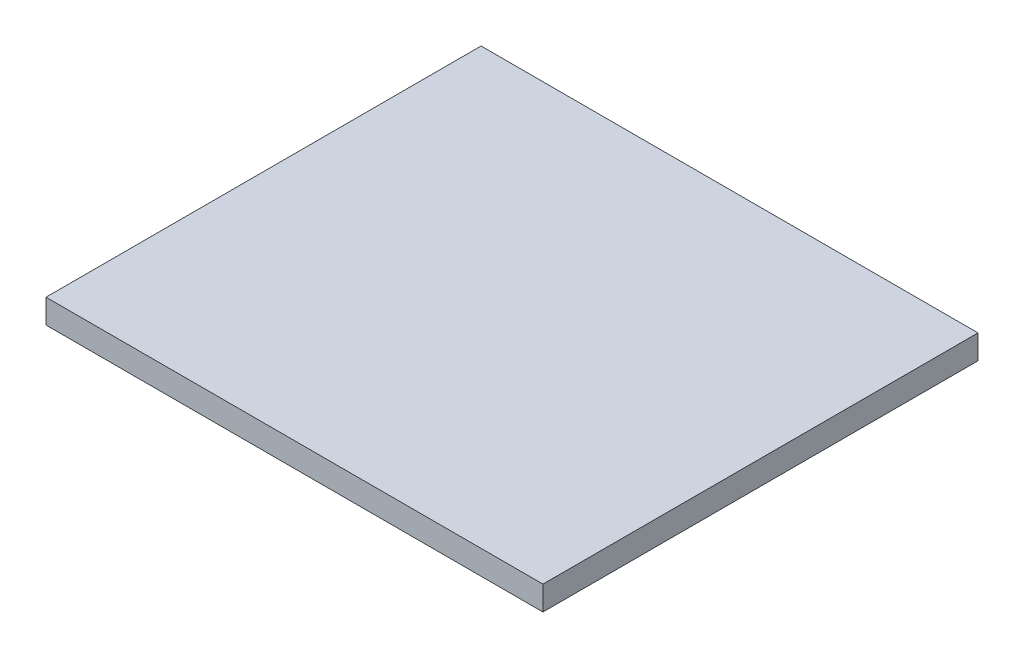
ISO-10303-21;
HEADER;
FILE_DESCRIPTION(('STEP AP214'),'2;1');
FILE_NAME('part.step','',(''),(''),'','','');
FILE_SCHEMA(('AUTOMOTIVE_DESIGN { 1 0 10303 214 1 1 1 1 }'));
ENDSEC;
DATA;
#1=APPLICATION_CONTEXT('core data for automotive mechanical design processes');
#2=APPLICATION_PROTOCOL_DEFINITION('international standard','automotive_design',2000,#1);
#3=PRODUCT_CONTEXT('',#1,'mechanical');
#4=PRODUCT('Part','Part','',(#3));
#5=PRODUCT_RELATED_PRODUCT_CATEGORY('part','',(#4));
#6=PRODUCT_DEFINITION_FORMATION('','',#4);
#7=PRODUCT_DEFINITION_CONTEXT('part definition',#1,'design');
#8=PRODUCT_DEFINITION('design','',#6,#7);
#9=PRODUCT_DEFINITION_SHAPE('','',#8);
#10=(LENGTH_UNIT() NAMED_UNIT(*) SI_UNIT(.MILLI.,.METRE.));
#11=(NAMED_UNIT(*) PLANE_ANGLE_UNIT() SI_UNIT($,.RADIAN.));
#12=(NAMED_UNIT(*) SI_UNIT($,.STERADIAN.) SOLID_ANGLE_UNIT());
#13=UNCERTAINTY_MEASURE_WITH_UNIT(LENGTH_MEASURE(1.E-05),#10,'distance_accuracy_value','');
#14=(GEOMETRIC_REPRESENTATION_CONTEXT(3) GLOBAL_UNCERTAINTY_ASSIGNED_CONTEXT((#13)) GLOBAL_UNIT_ASSIGNED_CONTEXT((#10,
#11,#12)) REPRESENTATION_CONTEXT('',''));
#15=CARTESIAN_POINT('',(0.,0.,0.));
#16=DIRECTION('',(0.,0.,1.));
#17=DIRECTION('',(1.,0.,0.));
#18=AXIS2_PLACEMENT_3D('',#15,#16,#17);
#19=CARTESIAN_POINT('',(13.1322838103947,1.,-58.7968161510852));
#20=DIRECTION('',(-1.,0.,0.));
#21=DIRECTION('',(0.,1.,0.));
#22=AXIS2_PLACEMENT_3D('',#19,#20,#21);
#23=PLANE('',#22);
#24=DIRECTION('',(0.,0.,-1.));
#25=VECTOR('',#24,1.);
#26=CARTESIAN_POINT('',(13.1322838103947,0.,-58.7968161510852));
#27=LINE('',#26,#25);
#28=CARTESIAN_POINT('',(13.1322838103947,0.,-40.7968161510852));
#29=VERTEX_POINT('',#28);
#30=CARTESIAN_POINT('',(13.1322838103947,0.,-58.7968161510852));
#31=VERTEX_POINT('',#30);
#32=EDGE_CURVE('E118',#29,#31,#27,.T.);
#33=ORIENTED_EDGE('',*,*,#32,.T.);
#34=DIRECTION('',(0.,-1.,0.));
#35=VECTOR('',#34,1.);
#36=CARTESIAN_POINT('',(13.1322838103947,1.,-58.7968161510852));
#37=LINE('',#36,#35);
#38=CARTESIAN_POINT('',(13.1322838103947,1.,-58.7968161510852));
#39=VERTEX_POINT('',#38);
#40=EDGE_CURVE('E9',#39,#31,#37,.T.);
#41=ORIENTED_EDGE('',*,*,#40,.F.);
#42=DIRECTION('',(0.,0.,-1.));
#43=VECTOR('',#42,1.);
#44=CARTESIAN_POINT('',(13.1322838103947,1.,-58.7968161510852));
#45=LINE('',#44,#43);
#46=CARTESIAN_POINT('',(13.1322838103947,1.,-40.7968161510852));
#47=VERTEX_POINT('',#46);
#48=EDGE_CURVE('E87',#47,#39,#45,.T.);
#49=ORIENTED_EDGE('',*,*,#48,.F.);
#50=DIRECTION('',(0.,-1.,0.));
#51=VECTOR('',#50,1.);
#52=CARTESIAN_POINT('',(13.1322838103947,1.,-40.7968161510852));
#53=LINE('',#52,#51);
#54=EDGE_CURVE('E69',#47,#29,#53,.T.);
#55=ORIENTED_EDGE('',*,*,#54,.T.);
#56=EDGE_LOOP('',(#33,#41,#49,#55));
#57=FACE_BOUND('',#56,.T.);
#58=ADVANCED_FACE('F15',(#57),#23,.F.);
#59=CARTESIAN_POINT('',(-7.42771618960535,1.,-58.7968161510852));
#60=DIRECTION('',(0.,0.,1.));
#61=DIRECTION('',(1.,0.,0.));
#62=AXIS2_PLACEMENT_3D('',#59,#60,#61);
#63=PLANE('',#62);
#64=DIRECTION('',(-1.,0.,0.));
#65=VECTOR('',#64,1.);
#66=CARTESIAN_POINT('',(-7.42771618960535,0.,-58.7968161510852));
#67=LINE('',#66,#65);
#68=CARTESIAN_POINT('',(-7.42771618960535,0.,-58.7968161510852));
#69=VERTEX_POINT('',#68);
#70=EDGE_CURVE('E93',#31,#69,#67,.T.);
#71=ORIENTED_EDGE('',*,*,#70,.T.);
#72=DIRECTION('',(0.,-1.,0.));
#73=VECTOR('',#72,1.);
#74=CARTESIAN_POINT('',(-7.42771618960535,1.,-58.7968161510852));
#75=LINE('',#74,#73);
#76=CARTESIAN_POINT('',(-7.42771618960535,1.,-58.7968161510852));
#77=VERTEX_POINT('',#76);
#78=EDGE_CURVE('E24',#77,#69,#75,.T.);
#79=ORIENTED_EDGE('',*,*,#78,.F.);
#80=DIRECTION('',(-1.,0.,0.));
#81=VECTOR('',#80,1.);
#82=CARTESIAN_POINT('',(-7.42771618960535,1.,-58.7968161510852));
#83=LINE('',#82,#81);
#84=EDGE_CURVE('E92',#39,#77,#83,.T.);
#85=ORIENTED_EDGE('',*,*,#84,.F.);
#86=ORIENTED_EDGE('',*,*,#40,.T.);
#87=EDGE_LOOP('',(#71,#79,#85,#86));
#88=FACE_BOUND('',#87,.T.);
#89=ADVANCED_FACE('F17',(#88),#63,.F.);
#90=CARTESIAN_POINT('',(-7.42771618960535,1.,-58.7968161510852));
#91=DIRECTION('',(1.,0.,0.));
#92=DIRECTION('',(0.,0.,-1.));
#93=AXIS2_PLACEMENT_3D('',#90,#91,#92);
#94=PLANE('',#93);
#95=DIRECTION('',(0.,0.,1.));
#96=VECTOR('',#95,1.);
#97=CARTESIAN_POINT('',(-7.42771618960535,0.,-58.7968161510852));
#98=LINE('',#97,#96);
#99=CARTESIAN_POINT('',(-7.42771618960534,0.,-40.7968161510852));
#100=VERTEX_POINT('',#99);
#101=EDGE_CURVE('E101',#69,#100,#98,.T.);
#102=ORIENTED_EDGE('',*,*,#101,.T.);
#103=DIRECTION('',(0.,-1.,0.));
#104=VECTOR('',#103,1.);
#105=CARTESIAN_POINT('',(-7.42771618960534,1.,-40.7968161510852));
#106=LINE('',#105,#104);
#107=CARTESIAN_POINT('',(-7.42771618960534,1.,-40.7968161510852));
#108=VERTEX_POINT('',#107);
#109=EDGE_CURVE('E37',#108,#100,#106,.T.);
#110=ORIENTED_EDGE('',*,*,#109,.F.);
#111=DIRECTION('',(0.,0.,1.));
#112=VECTOR('',#111,1.);
#113=CARTESIAN_POINT('',(-7.42771618960535,1.,-58.7968161510852));
#114=LINE('',#113,#112);
#115=EDGE_CURVE('E88',#77,#108,#114,.T.);
#116=ORIENTED_EDGE('',*,*,#115,.F.);
#117=ORIENTED_EDGE('',*,*,#78,.T.);
#118=EDGE_LOOP('',(#102,#110,#116,#117));
#119=FACE_BOUND('',#118,.T.);
#120=ADVANCED_FACE('F113',(#119),#94,.F.);
#121=CARTESIAN_POINT('',(-7.42771618960534,1.,-40.7968161510852));
#122=DIRECTION('',(0.,0.,-1.));
#123=DIRECTION('',(0.,-1.,0.));
#124=AXIS2_PLACEMENT_3D('',#121,#122,#123);
#125=PLANE('',#124);
#126=DIRECTION('',(1.,0.,0.));
#127=VECTOR('',#126,1.);
#128=CARTESIAN_POINT('',(-7.42771618960534,0.,-40.7968161510852));
#129=LINE('',#128,#127);
#130=EDGE_CURVE('E76',#100,#29,#129,.T.);
#131=ORIENTED_EDGE('',*,*,#130,.T.);
#132=ORIENTED_EDGE('',*,*,#54,.F.);
#133=DIRECTION('',(1.,0.,0.));
#134=VECTOR('',#133,1.);
#135=CARTESIAN_POINT('',(-7.42771618960534,1.,-40.7968161510852));
#136=LINE('',#135,#134);
#137=EDGE_CURVE('E72',#108,#47,#136,.T.);
#138=ORIENTED_EDGE('',*,*,#137,.F.);
#139=ORIENTED_EDGE('',*,*,#109,.T.);
#140=EDGE_LOOP('',(#131,#132,#138,#139));
#141=FACE_BOUND('',#140,.T.);
#142=ADVANCED_FACE('F71',(#141),#125,.F.);
#143=CARTESIAN_POINT('',(0.,1.,0.));
#144=DIRECTION('',(0.,1.,0.));
#145=DIRECTION('',(1.,0.,0.));
#146=AXIS2_PLACEMENT_3D('',#143,#144,#145);
#147=PLANE('',#146);
#148=ORIENTED_EDGE('',*,*,#48,.T.);
#149=ORIENTED_EDGE('',*,*,#84,.T.);
#150=ORIENTED_EDGE('',*,*,#115,.T.);
#151=ORIENTED_EDGE('',*,*,#137,.T.);
#152=EDGE_LOOP('',(#148,#149,#150,#151));
#153=FACE_BOUND('',#152,.T.);
#154=ADVANCED_FACE('F85',(#153),#147,.T.);
#155=CARTESIAN_POINT('',(0.,0.,0.));
#156=DIRECTION('',(0.,1.,0.));
#157=DIRECTION('',(1.,0.,0.));
#158=AXIS2_PLACEMENT_3D('',#155,#156,#157);
#159=PLANE('',#158);
#160=ORIENTED_EDGE('',*,*,#32,.F.);
#161=ORIENTED_EDGE('',*,*,#130,.F.);
#162=ORIENTED_EDGE('',*,*,#101,.F.);
#163=ORIENTED_EDGE('',*,*,#70,.F.);
#164=EDGE_LOOP('',(#160,#161,#162,#163));
#165=FACE_BOUND('',#164,.T.);
#166=ADVANCED_FACE('F117',(#165),#159,.F.);
#167=CLOSED_SHELL('',(#58,#89,#120,#142,#154,#166));
#168=MANIFOLD_SOLID_BREP('B1',#167);
#169=ADVANCED_BREP_SHAPE_REPRESENTATION('',(#18,#168),#14);
#170=SHAPE_DEFINITION_REPRESENTATION(#9,#169);
ENDSEC;
END-ISO-10303-21;
